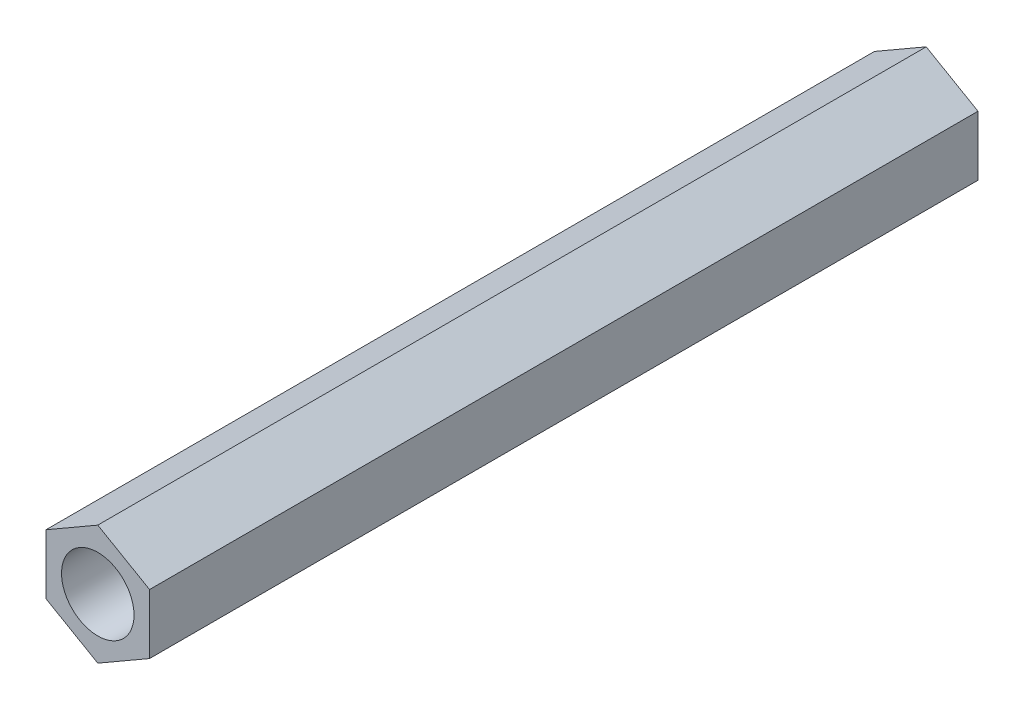
ISO-10303-21;
HEADER;
FILE_DESCRIPTION(('STEP AP214'),'2;1');
FILE_NAME('part.step','',(''),(''),'','','');
FILE_SCHEMA(('AUTOMOTIVE_DESIGN { 1 0 10303 214 1 1 1 1 }'));
ENDSEC;
DATA;
#1=APPLICATION_CONTEXT('core data for automotive mechanical design processes');
#2=APPLICATION_PROTOCOL_DEFINITION('international standard','automotive_design',2000,#1);
#3=PRODUCT_CONTEXT('',#1,'mechanical');
#4=PRODUCT('Part','Part','',(#3));
#5=PRODUCT_RELATED_PRODUCT_CATEGORY('part','',(#4));
#6=PRODUCT_DEFINITION_FORMATION('','',#4);
#7=PRODUCT_DEFINITION_CONTEXT('part definition',#1,'design');
#8=PRODUCT_DEFINITION('design','',#6,#7);
#9=PRODUCT_DEFINITION_SHAPE('','',#8);
#10=(LENGTH_UNIT() NAMED_UNIT(*) SI_UNIT(.MILLI.,.METRE.));
#11=(NAMED_UNIT(*) PLANE_ANGLE_UNIT() SI_UNIT($,.RADIAN.));
#12=(NAMED_UNIT(*) SI_UNIT($,.STERADIAN.) SOLID_ANGLE_UNIT());
#13=UNCERTAINTY_MEASURE_WITH_UNIT(LENGTH_MEASURE(1.E-05),#10,'distance_accuracy_value','');
#14=(GEOMETRIC_REPRESENTATION_CONTEXT(3) GLOBAL_UNCERTAINTY_ASSIGNED_CONTEXT((#13)) GLOBAL_UNIT_ASSIGNED_CONTEXT((#10,
#11,#12)) REPRESENTATION_CONTEXT('',''));
#15=CARTESIAN_POINT('',(0.,0.,0.));
#16=DIRECTION('',(0.,0.,1.));
#17=DIRECTION('',(1.,0.,0.));
#18=AXIS2_PLACEMENT_3D('',#15,#16,#17);
#19=CARTESIAN_POINT('',(-2.49999999999998,-1.44337567297409,40.));
#20=DIRECTION('',(0.499999999999995,0.866025403784442,0.));
#21=DIRECTION('',(-0.866025403784442,0.499999999999995,0.));
#22=AXIS2_PLACEMENT_3D('',#19,#20,#21);
#23=PLANE('',#22);
#24=DIRECTION('',(0.866025403784442,-0.499999999999995,0.));
#25=VECTOR('',#24,1.);
#26=CARTESIAN_POINT('',(-2.49999999999998,-1.44337567297409,0.));
#27=LINE('',#26,#25);
#28=CARTESIAN_POINT('',(-2.49999999999998,-1.44337567297409,0.));
#29=VERTEX_POINT('',#28);
#30=CARTESIAN_POINT('',(0.,-2.88675134594813,0.));
#31=VERTEX_POINT('',#30);
#32=EDGE_CURVE('E117',#29,#31,#27,.T.);
#33=ORIENTED_EDGE('',*,*,#32,.T.);
#34=DIRECTION('',(0.,0.,-1.));
#35=VECTOR('',#34,1.);
#36=CARTESIAN_POINT('',(0.,-2.88675134594813,40.));
#37=LINE('',#36,#35);
#38=CARTESIAN_POINT('',(0.,-2.88675134594813,40.));
#39=VERTEX_POINT('',#38);
#40=EDGE_CURVE('E11',#39,#31,#37,.T.);
#41=ORIENTED_EDGE('',*,*,#40,.F.);
#42=DIRECTION('',(0.866025403784442,-0.499999999999995,0.));
#43=VECTOR('',#42,1.);
#44=CARTESIAN_POINT('',(-2.49999999999998,-1.44337567297409,40.));
#45=LINE('',#44,#43);
#46=CARTESIAN_POINT('',(-2.49999999999998,-1.44337567297409,40.));
#47=VERTEX_POINT('',#46);
#48=EDGE_CURVE('E128',#47,#39,#45,.T.);
#49=ORIENTED_EDGE('',*,*,#48,.F.);
#50=DIRECTION('',(0.,0.,-1.));
#51=VECTOR('',#50,1.);
#52=CARTESIAN_POINT('',(-2.49999999999998,-1.44337567297409,40.));
#53=LINE('',#52,#51);
#54=EDGE_CURVE('E113',#47,#29,#53,.T.);
#55=ORIENTED_EDGE('',*,*,#54,.T.);
#56=EDGE_LOOP('',(#33,#41,#49,#55));
#57=FACE_BOUND('',#56,.T.);
#58=ADVANCED_FACE('F33',(#57),#23,.F.);
#59=CARTESIAN_POINT('',(0.,-2.88675134594813,40.));
#60=DIRECTION('',(-0.500000000000001,0.866025403784438,0.));
#61=DIRECTION('',(-0.866025403784438,-0.500000000000001,0.));
#62=AXIS2_PLACEMENT_3D('',#59,#60,#61);
#63=PLANE('',#62);
#64=DIRECTION('',(0.866025403784438,0.500000000000001,0.));
#65=VECTOR('',#64,1.);
#66=CARTESIAN_POINT('',(0.,-2.88675134594813,0.));
#67=LINE('',#66,#65);
#68=CARTESIAN_POINT('',(2.50000000000001,-1.44337567297406,0.));
#69=VERTEX_POINT('',#68);
#70=EDGE_CURVE('E120',#31,#69,#67,.T.);
#71=ORIENTED_EDGE('',*,*,#70,.T.);
#72=DIRECTION('',(0.,0.,-1.));
#73=VECTOR('',#72,1.);
#74=CARTESIAN_POINT('',(2.50000000000001,-1.44337567297406,40.));
#75=LINE('',#74,#73);
#76=CARTESIAN_POINT('',(2.50000000000001,-1.44337567297406,40.));
#77=VERTEX_POINT('',#76);
#78=EDGE_CURVE('E41',#77,#69,#75,.T.);
#79=ORIENTED_EDGE('',*,*,#78,.F.);
#80=DIRECTION('',(0.866025403784438,0.500000000000001,0.));
#81=VECTOR('',#80,1.);
#82=CARTESIAN_POINT('',(0.,-2.88675134594813,40.));
#83=LINE('',#82,#81);
#84=EDGE_CURVE('E86',#39,#77,#83,.T.);
#85=ORIENTED_EDGE('',*,*,#84,.F.);
#86=ORIENTED_EDGE('',*,*,#40,.T.);
#87=EDGE_LOOP('',(#71,#79,#85,#86));
#88=FACE_BOUND('',#87,.T.);
#89=ADVANCED_FACE('F153',(#88),#63,.F.);
#90=CARTESIAN_POINT('',(2.50000000000001,-1.44337567297406,40.));
#91=DIRECTION('',(-1.,0.,0.));
#92=DIRECTION('',(0.,-1.,0.));
#93=AXIS2_PLACEMENT_3D('',#90,#91,#92);
#94=PLANE('',#93);
#95=DIRECTION('',(0.,1.,0.));
#96=VECTOR('',#95,1.);
#97=CARTESIAN_POINT('',(2.50000000000001,-1.44337567297406,0.));
#98=LINE('',#97,#96);
#99=CARTESIAN_POINT('',(2.49999999999999,1.44337567297408,0.));
#100=VERTEX_POINT('',#99);
#101=EDGE_CURVE('E123',#69,#100,#98,.T.);
#102=ORIENTED_EDGE('',*,*,#101,.T.);
#103=DIRECTION('',(0.,0.,-1.));
#104=VECTOR('',#103,1.);
#105=CARTESIAN_POINT('',(2.49999999999999,1.44337567297408,40.));
#106=LINE('',#105,#104);
#107=CARTESIAN_POINT('',(2.49999999999999,1.44337567297408,40.));
#108=VERTEX_POINT('',#107);
#109=EDGE_CURVE('E108',#108,#100,#106,.T.);
#110=ORIENTED_EDGE('',*,*,#109,.F.);
#111=DIRECTION('',(0.,1.,0.));
#112=VECTOR('',#111,1.);
#113=CARTESIAN_POINT('',(2.50000000000001,-1.44337567297406,40.));
#114=LINE('',#113,#112);
#115=EDGE_CURVE('E99',#77,#108,#114,.T.);
#116=ORIENTED_EDGE('',*,*,#115,.F.);
#117=ORIENTED_EDGE('',*,*,#78,.T.);
#118=EDGE_LOOP('',(#102,#110,#116,#117));
#119=FACE_BOUND('',#118,.T.);
#120=ADVANCED_FACE('F134',(#119),#94,.F.);
#121=CARTESIAN_POINT('',(2.49999999999999,1.44337567297408,40.));
#122=DIRECTION('',(-0.499999999999995,-0.866025403784442,0.));
#123=DIRECTION('',(0.866025403784442,-0.499999999999995,0.));
#124=AXIS2_PLACEMENT_3D('',#121,#122,#123);
#125=PLANE('',#124);
#126=DIRECTION('',(-0.866025403784441,0.499999999999995,0.));
#127=VECTOR('',#126,1.);
#128=CARTESIAN_POINT('',(2.49999999999999,1.44337567297408,0.));
#129=LINE('',#128,#127);
#130=CARTESIAN_POINT('',(0.,2.88675134594813,0.));
#131=VERTEX_POINT('',#130);
#132=EDGE_CURVE('E107',#100,#131,#129,.T.);
#133=ORIENTED_EDGE('',*,*,#132,.T.);
#134=DIRECTION('',(0.,0.,-1.));
#135=VECTOR('',#134,1.);
#136=CARTESIAN_POINT('',(0.,2.88675134594813,40.));
#137=LINE('',#136,#135);
#138=CARTESIAN_POINT('',(0.,2.88675134594813,40.));
#139=VERTEX_POINT('',#138);
#140=EDGE_CURVE('E104',#139,#131,#137,.T.);
#141=ORIENTED_EDGE('',*,*,#140,.F.);
#142=DIRECTION('',(-0.866025403784441,0.499999999999995,0.));
#143=VECTOR('',#142,1.);
#144=CARTESIAN_POINT('',(2.49999999999999,1.44337567297408,40.));
#145=LINE('',#144,#143);
#146=EDGE_CURVE('E93',#108,#139,#145,.T.);
#147=ORIENTED_EDGE('',*,*,#146,.F.);
#148=ORIENTED_EDGE('',*,*,#109,.T.);
#149=EDGE_LOOP('',(#133,#141,#147,#148));
#150=FACE_BOUND('',#149,.T.);
#151=ADVANCED_FACE('F105',(#150),#125,.F.);
#152=CARTESIAN_POINT('',(0.,2.88675134594813,40.));
#153=DIRECTION('',(0.500000000000007,-0.866025403784435,0.));
#154=DIRECTION('',(0.866025403784435,0.500000000000007,0.));
#155=AXIS2_PLACEMENT_3D('',#152,#153,#154);
#156=PLANE('',#155);
#157=DIRECTION('',(-0.866025403784435,-0.500000000000007,0.));
#158=VECTOR('',#157,1.);
#159=CARTESIAN_POINT('',(0.,2.88675134594813,0.));
#160=LINE('',#159,#158);
#161=CARTESIAN_POINT('',(-2.50000000000002,1.44337567297404,0.));
#162=VERTEX_POINT('',#161);
#163=EDGE_CURVE('E72',#131,#162,#160,.T.);
#164=ORIENTED_EDGE('',*,*,#163,.T.);
#165=DIRECTION('',(0.,0.,-1.));
#166=VECTOR('',#165,1.);
#167=CARTESIAN_POINT('',(-2.50000000000002,1.44337567297404,40.));
#168=LINE('',#167,#166);
#169=CARTESIAN_POINT('',(-2.50000000000002,1.44337567297404,40.));
#170=VERTEX_POINT('',#169);
#171=EDGE_CURVE('E109',#170,#162,#168,.T.);
#172=ORIENTED_EDGE('',*,*,#171,.F.);
#173=DIRECTION('',(-0.866025403784435,-0.500000000000007,0.));
#174=VECTOR('',#173,1.);
#175=CARTESIAN_POINT('',(0.,2.88675134594813,40.));
#176=LINE('',#175,#174);
#177=EDGE_CURVE('E97',#139,#170,#176,.T.);
#178=ORIENTED_EDGE('',*,*,#177,.F.);
#179=ORIENTED_EDGE('',*,*,#140,.T.);
#180=EDGE_LOOP('',(#164,#172,#178,#179));
#181=FACE_BOUND('',#180,.T.);
#182=ADVANCED_FACE('F111',(#181),#156,.F.);
#183=CARTESIAN_POINT('',(-2.50000000000002,1.44337567297404,40.));
#184=DIRECTION('',(1.,0.,0.));
#185=DIRECTION('',(0.,1.,0.));
#186=AXIS2_PLACEMENT_3D('',#183,#184,#185);
#187=PLANE('',#186);
#188=DIRECTION('',(0.,-1.,0.));
#189=VECTOR('',#188,1.);
#190=CARTESIAN_POINT('',(-2.50000000000002,1.44337567297404,0.));
#191=LINE('',#190,#189);
#192=EDGE_CURVE('E78',#162,#29,#191,.T.);
#193=ORIENTED_EDGE('',*,*,#192,.T.);
#194=ORIENTED_EDGE('',*,*,#54,.F.);
#195=DIRECTION('',(0.,-1.,0.));
#196=VECTOR('',#195,1.);
#197=CARTESIAN_POINT('',(-2.50000000000002,1.44337567297404,40.));
#198=LINE('',#197,#196);
#199=EDGE_CURVE('E49',#170,#47,#198,.T.);
#200=ORIENTED_EDGE('',*,*,#199,.F.);
#201=ORIENTED_EDGE('',*,*,#171,.T.);
#202=EDGE_LOOP('',(#193,#194,#200,#201));
#203=FACE_BOUND('',#202,.T.);
#204=ADVANCED_FACE('F141',(#203),#187,.F.);
#205=CARTESIAN_POINT('',(0.,0.,40.));
#206=DIRECTION('',(0.,0.,1.));
#207=DIRECTION('',(1.,0.,0.));
#208=AXIS2_PLACEMENT_3D('',#205,#206,#207);
#209=PLANE('',#208);
#210=CARTESIAN_POINT('',(0.,0.,40.));
#211=DIRECTION('',(0.,0.,1.));
#212=DIRECTION('',(1.,0.,0.));
#213=AXIS2_PLACEMENT_3D('',#210,#211,#212);
#214=CIRCLE('',#213,1.75);
#215=CARTESIAN_POINT('',(1.75,0.,40.));
#216=VERTEX_POINT('',#215);
#217=EDGE_CURVE('E121',#216,#216,#214,.T.);
#218=ORIENTED_EDGE('',*,*,#217,.F.);
#219=EDGE_LOOP('',(#218));
#220=FACE_BOUND('',#219,.T.);
#221=ORIENTED_EDGE('',*,*,#48,.T.);
#222=ORIENTED_EDGE('',*,*,#84,.T.);
#223=ORIENTED_EDGE('',*,*,#115,.T.);
#224=ORIENTED_EDGE('',*,*,#146,.T.);
#225=ORIENTED_EDGE('',*,*,#177,.T.);
#226=ORIENTED_EDGE('',*,*,#199,.T.);
#227=EDGE_LOOP('',(#221,#222,#223,#224,#225,#226));
#228=FACE_BOUND('',#227,.T.);
#229=ADVANCED_FACE('F95',(#220,#228),#209,.T.);
#230=CARTESIAN_POINT('',(0.,0.,0.));
#231=DIRECTION('',(0.,0.,1.));
#232=DIRECTION('',(1.,0.,0.));
#233=AXIS2_PLACEMENT_3D('',#230,#231,#232);
#234=PLANE('',#233);
#235=CARTESIAN_POINT('',(0.,0.,0.));
#236=DIRECTION('',(0.,0.,1.));
#237=DIRECTION('',(1.,0.,0.));
#238=AXIS2_PLACEMENT_3D('',#235,#236,#237);
#239=CIRCLE('',#238,1.75);
#240=CARTESIAN_POINT('',(1.75,0.,0.));
#241=VERTEX_POINT('',#240);
#242=EDGE_CURVE('E208',#241,#241,#239,.T.);
#243=ORIENTED_EDGE('',*,*,#242,.T.);
#244=EDGE_LOOP('',(#243));
#245=FACE_BOUND('',#244,.T.);
#246=ORIENTED_EDGE('',*,*,#32,.F.);
#247=ORIENTED_EDGE('',*,*,#192,.F.);
#248=ORIENTED_EDGE('',*,*,#163,.F.);
#249=ORIENTED_EDGE('',*,*,#132,.F.);
#250=ORIENTED_EDGE('',*,*,#101,.F.);
#251=ORIENTED_EDGE('',*,*,#70,.F.);
#252=EDGE_LOOP('',(#246,#247,#248,#249,#250,#251));
#253=FACE_BOUND('',#252,.T.);
#254=ADVANCED_FACE('F137',(#245,#253),#234,.F.);
#255=CARTESIAN_POINT('',(0.,0.,0.));
#256=DIRECTION('',(0.,0.,1.));
#257=DIRECTION('',(1.,0.,0.));
#258=AXIS2_PLACEMENT_3D('',#255,#256,#257);
#259=CYLINDRICAL_SURFACE('',#258,1.75);
#260=ORIENTED_EDGE('',*,*,#217,.T.);
#261=EDGE_LOOP('',(#260));
#262=FACE_BOUND('',#261,.T.);
#263=ORIENTED_EDGE('',*,*,#242,.F.);
#264=EDGE_LOOP('',(#263));
#265=FACE_BOUND('',#264,.T.);
#266=ADVANCED_FACE('F190',(#262,#265),#259,.F.);
#267=CLOSED_SHELL('',(#58,#89,#120,#151,#182,#204,#229,#254,#266));
#268=MANIFOLD_SOLID_BREP('B2',#267);
#269=ADVANCED_BREP_SHAPE_REPRESENTATION('',(#18,#268),#14);
#270=SHAPE_DEFINITION_REPRESENTATION(#9,#269);
ENDSEC;
END-ISO-10303-21;
